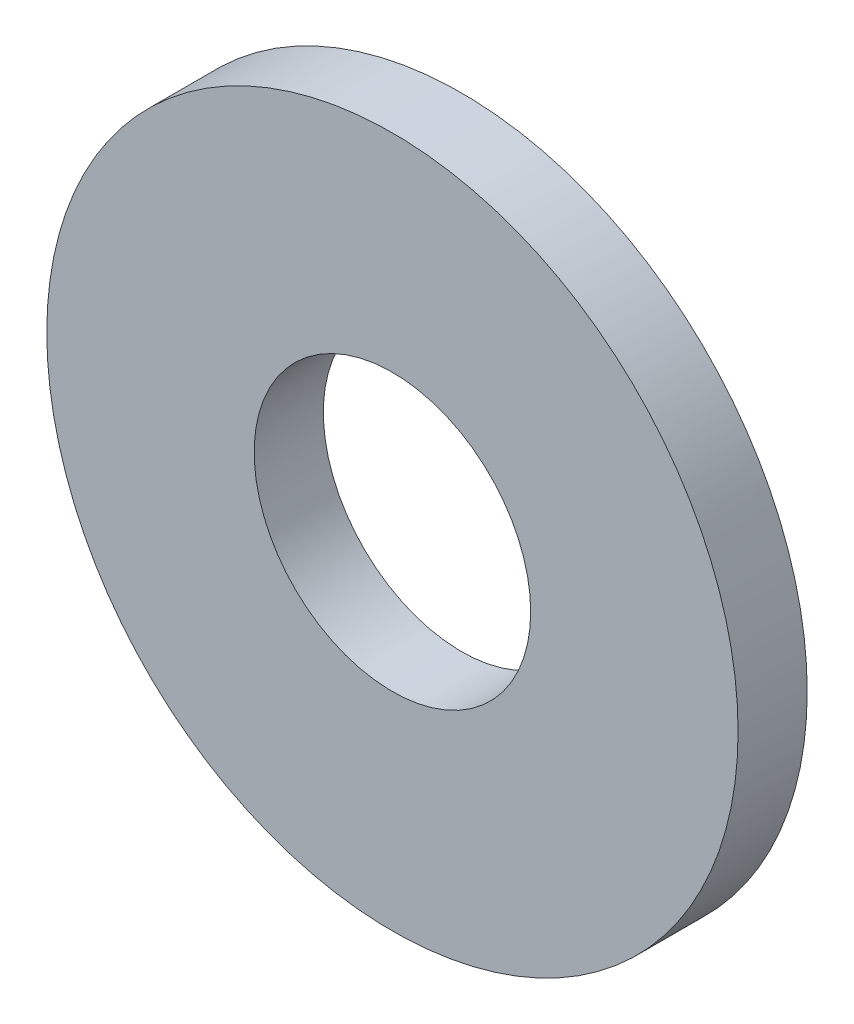
ISO-10303-21;
HEADER;
FILE_DESCRIPTION(('STEP AP214'),'2;1');
FILE_NAME('part.step','',(''),(''),'','','');
FILE_SCHEMA(('AUTOMOTIVE_DESIGN { 1 0 10303 214 1 1 1 1 }'));
ENDSEC;
DATA;
#1=APPLICATION_CONTEXT('core data for automotive mechanical design processes');
#2=APPLICATION_PROTOCOL_DEFINITION('international standard','automotive_design',2000,#1);
#3=PRODUCT_CONTEXT('',#1,'mechanical');
#4=PRODUCT('Part','Part','',(#3));
#5=PRODUCT_RELATED_PRODUCT_CATEGORY('part','',(#4));
#6=PRODUCT_DEFINITION_FORMATION('','',#4);
#7=PRODUCT_DEFINITION_CONTEXT('part definition',#1,'design');
#8=PRODUCT_DEFINITION('design','',#6,#7);
#9=PRODUCT_DEFINITION_SHAPE('','',#8);
#10=(LENGTH_UNIT() NAMED_UNIT(*) SI_UNIT(.MILLI.,.METRE.));
#11=(NAMED_UNIT(*) PLANE_ANGLE_UNIT() SI_UNIT($,.RADIAN.));
#12=(NAMED_UNIT(*) SI_UNIT($,.STERADIAN.) SOLID_ANGLE_UNIT());
#13=UNCERTAINTY_MEASURE_WITH_UNIT(LENGTH_MEASURE(1.E-05),#10,'distance_accuracy_value','');
#14=(GEOMETRIC_REPRESENTATION_CONTEXT(3) GLOBAL_UNCERTAINTY_ASSIGNED_CONTEXT((#13)) GLOBAL_UNIT_ASSIGNED_CONTEXT((#10,
#11,#12)) REPRESENTATION_CONTEXT('',''));
#15=CARTESIAN_POINT('',(0.,0.,0.));
#16=DIRECTION('',(0.,0.,1.));
#17=DIRECTION('',(1.,0.,0.));
#18=AXIS2_PLACEMENT_3D('',#15,#16,#17);
#19=CARTESIAN_POINT('',(0.,0.,1.5875));
#20=DIRECTION('',(0.,0.,1.));
#21=DIRECTION('',(1.,0.,0.));
#22=AXIS2_PLACEMENT_3D('',#19,#20,#21);
#23=PLANE('',#22);
#24=CARTESIAN_POINT('',(0.,0.,1.5875));
#25=DIRECTION('',(0.,0.,1.));
#26=DIRECTION('',(1.,0.,0.));
#27=AXIS2_PLACEMENT_3D('',#24,#25,#26);
#28=CIRCLE('',#27,7.9375);
#29=CARTESIAN_POINT('',(7.9375,0.,1.5875));
#30=VERTEX_POINT('',#29);
#31=EDGE_CURVE('E10',#30,#30,#28,.T.);
#32=ORIENTED_EDGE('',*,*,#31,.T.);
#33=EDGE_LOOP('',(#32));
#34=FACE_BOUND('',#33,.T.);
#35=CARTESIAN_POINT('',(0.,0.,1.5875));
#36=DIRECTION('',(0.,0.,1.));
#37=DIRECTION('',(1.,0.,0.));
#38=AXIS2_PLACEMENT_3D('',#35,#36,#37);
#39=CIRCLE('',#38,3.175);
#40=CARTESIAN_POINT('',(3.175,0.,1.5875));
#41=VERTEX_POINT('',#40);
#42=EDGE_CURVE('E43',#41,#41,#39,.T.);
#43=ORIENTED_EDGE('',*,*,#42,.F.);
#44=EDGE_LOOP('',(#43));
#45=FACE_BOUND('',#44,.T.);
#46=ADVANCED_FACE('F32',(#34,#45),#23,.T.);
#47=CARTESIAN_POINT('',(0.,0.,0.));
#48=DIRECTION('',(0.,0.,1.));
#49=DIRECTION('',(1.,0.,0.));
#50=AXIS2_PLACEMENT_3D('',#47,#48,#49);
#51=PLANE('',#50);
#52=CARTESIAN_POINT('',(0.,0.,0.));
#53=DIRECTION('',(0.,0.,1.));
#54=DIRECTION('',(1.,0.,0.));
#55=AXIS2_PLACEMENT_3D('',#52,#53,#54);
#56=CIRCLE('',#55,7.9375);
#57=CARTESIAN_POINT('',(7.9375,0.,0.));
#58=VERTEX_POINT('',#57);
#59=EDGE_CURVE('E36',#58,#58,#56,.T.);
#60=ORIENTED_EDGE('',*,*,#59,.F.);
#61=EDGE_LOOP('',(#60));
#62=FACE_BOUND('',#61,.T.);
#63=CARTESIAN_POINT('',(0.,0.,0.));
#64=DIRECTION('',(0.,0.,1.));
#65=DIRECTION('',(1.,0.,0.));
#66=AXIS2_PLACEMENT_3D('',#63,#64,#65);
#67=CIRCLE('',#66,3.175);
#68=CARTESIAN_POINT('',(3.175,0.,0.));
#69=VERTEX_POINT('',#68);
#70=EDGE_CURVE('E45',#69,#69,#67,.T.);
#71=ORIENTED_EDGE('',*,*,#70,.T.);
#72=EDGE_LOOP('',(#71));
#73=FACE_BOUND('',#72,.T.);
#74=ADVANCED_FACE('F55',(#62,#73),#51,.F.);
#75=CARTESIAN_POINT('',(0.,0.,1.5875));
#76=DIRECTION('',(0.,0.,-1.));
#77=DIRECTION('',(-1.,0.,0.));
#78=AXIS2_PLACEMENT_3D('',#75,#76,#77);
#79=CYLINDRICAL_SURFACE('',#78,7.9375);
#80=ORIENTED_EDGE('',*,*,#31,.F.);
#81=EDGE_LOOP('',(#80));
#82=FACE_BOUND('',#81,.T.);
#83=ORIENTED_EDGE('',*,*,#59,.T.);
#84=EDGE_LOOP('',(#83));
#85=FACE_BOUND('',#84,.T.);
#86=ADVANCED_FACE('F34',(#82,#85),#79,.T.);
#87=CARTESIAN_POINT('',(0.,0.,1.5875));
#88=DIRECTION('',(0.,0.,-1.));
#89=DIRECTION('',(-1.,0.,0.));
#90=AXIS2_PLACEMENT_3D('',#87,#88,#89);
#91=CYLINDRICAL_SURFACE('',#90,3.175);
#92=ORIENTED_EDGE('',*,*,#42,.T.);
#93=EDGE_LOOP('',(#92));
#94=FACE_BOUND('',#93,.T.);
#95=ORIENTED_EDGE('',*,*,#70,.F.);
#96=EDGE_LOOP('',(#95));
#97=FACE_BOUND('',#96,.T.);
#98=ADVANCED_FACE('F51',(#94,#97),#91,.F.);
#99=CLOSED_SHELL('',(#46,#74,#86,#98));
#100=MANIFOLD_SOLID_BREP('B2',#99);
#101=ADVANCED_BREP_SHAPE_REPRESENTATION('',(#18,#100),#14);
#102=SHAPE_DEFINITION_REPRESENTATION(#9,#101);
ENDSEC;
END-ISO-10303-21;
